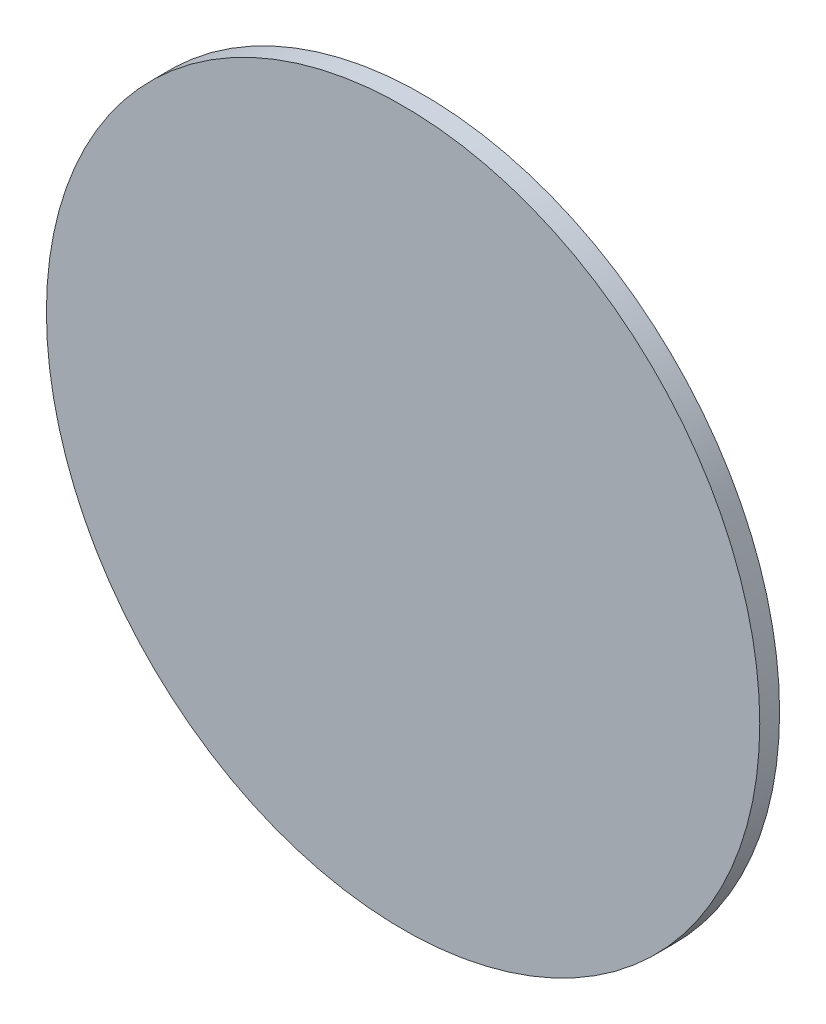
ISO-10303-21;
HEADER;
FILE_DESCRIPTION(('STEP AP214'),'2;1');
FILE_NAME('part.step','',(''),(''),'','','');
FILE_SCHEMA(('AUTOMOTIVE_DESIGN { 1 0 10303 214 1 1 1 1 }'));
ENDSEC;
DATA;
#1=APPLICATION_CONTEXT('core data for automotive mechanical design processes');
#2=APPLICATION_PROTOCOL_DEFINITION('international standard','automotive_design',2000,#1);
#3=PRODUCT_CONTEXT('',#1,'mechanical');
#4=PRODUCT('Part','Part','',(#3));
#5=PRODUCT_RELATED_PRODUCT_CATEGORY('part','',(#4));
#6=PRODUCT_DEFINITION_FORMATION('','',#4);
#7=PRODUCT_DEFINITION_CONTEXT('part definition',#1,'design');
#8=PRODUCT_DEFINITION('design','',#6,#7);
#9=PRODUCT_DEFINITION_SHAPE('','',#8);
#10=(LENGTH_UNIT() NAMED_UNIT(*) SI_UNIT(.MILLI.,.METRE.));
#11=(NAMED_UNIT(*) PLANE_ANGLE_UNIT() SI_UNIT($,.RADIAN.));
#12=(NAMED_UNIT(*) SI_UNIT($,.STERADIAN.) SOLID_ANGLE_UNIT());
#13=UNCERTAINTY_MEASURE_WITH_UNIT(LENGTH_MEASURE(1.E-05),#10,'distance_accuracy_value','');
#14=(GEOMETRIC_REPRESENTATION_CONTEXT(3) GLOBAL_UNCERTAINTY_ASSIGNED_CONTEXT((#13)) GLOBAL_UNIT_ASSIGNED_CONTEXT((#10,
#11,#12)) REPRESENTATION_CONTEXT('',''));
#15=CARTESIAN_POINT('',(0.,0.,0.));
#16=DIRECTION('',(0.,0.,1.));
#17=DIRECTION('',(1.,0.,0.));
#18=AXIS2_PLACEMENT_3D('',#15,#16,#17);
#19=CARTESIAN_POINT('',(589.5,151.,5.));
#20=DIRECTION('',(0.,0.,1.));
#21=DIRECTION('',(1.,0.,0.));
#22=AXIS2_PLACEMENT_3D('',#19,#20,#21);
#23=PLANE('',#22);
#24=CARTESIAN_POINT('',(589.5,151.,5.));
#25=DIRECTION('',(0.,0.,1.));
#26=DIRECTION('',(1.,0.,0.));
#27=AXIS2_PLACEMENT_3D('',#24,#25,#26);
#28=CIRCLE('',#27,89.9999999999999);
#29=CARTESIAN_POINT('',(679.5,151.,5.));
#30=VERTEX_POINT('',#29);
#31=EDGE_CURVE('E10',#30,#30,#28,.T.);
#32=ORIENTED_EDGE('',*,*,#31,.T.);
#33=EDGE_LOOP('',(#32));
#34=FACE_BOUND('',#33,.T.);
#35=ADVANCED_FACE('F31',(#34),#23,.T.);
#36=CARTESIAN_POINT('',(589.5,151.,0.));
#37=DIRECTION('',(0.,0.,1.));
#38=DIRECTION('',(1.,0.,0.));
#39=AXIS2_PLACEMENT_3D('',#36,#37,#38);
#40=PLANE('',#39);
#41=CARTESIAN_POINT('',(589.5,151.,0.));
#42=DIRECTION('',(0.,0.,1.));
#43=DIRECTION('',(1.,0.,0.));
#44=AXIS2_PLACEMENT_3D('',#41,#42,#43);
#45=CIRCLE('',#44,89.9999999999999);
#46=CARTESIAN_POINT('',(679.5,151.,0.));
#47=VERTEX_POINT('',#46);
#48=EDGE_CURVE('E35',#47,#47,#45,.T.);
#49=ORIENTED_EDGE('',*,*,#48,.F.);
#50=EDGE_LOOP('',(#49));
#51=FACE_BOUND('',#50,.T.);
#52=ADVANCED_FACE('F45',(#51),#40,.F.);
#53=CARTESIAN_POINT('',(589.5,151.,5.));
#54=DIRECTION('',(0.,0.,-1.));
#55=DIRECTION('',(-1.,0.,0.));
#56=AXIS2_PLACEMENT_3D('',#53,#54,#55);
#57=CYLINDRICAL_SURFACE('',#56,89.9999999999999);
#58=ORIENTED_EDGE('',*,*,#31,.F.);
#59=EDGE_LOOP('',(#58));
#60=FACE_BOUND('',#59,.T.);
#61=ORIENTED_EDGE('',*,*,#48,.T.);
#62=EDGE_LOOP('',(#61));
#63=FACE_BOUND('',#62,.T.);
#64=ADVANCED_FACE('F33',(#60,#63),#57,.T.);
#65=CLOSED_SHELL('',(#35,#52,#64));
#66=MANIFOLD_SOLID_BREP('B2',#65);
#67=ADVANCED_BREP_SHAPE_REPRESENTATION('',(#18,#66),#14);
#68=SHAPE_DEFINITION_REPRESENTATION(#9,#67);
ENDSEC;
END-ISO-10303-21;
